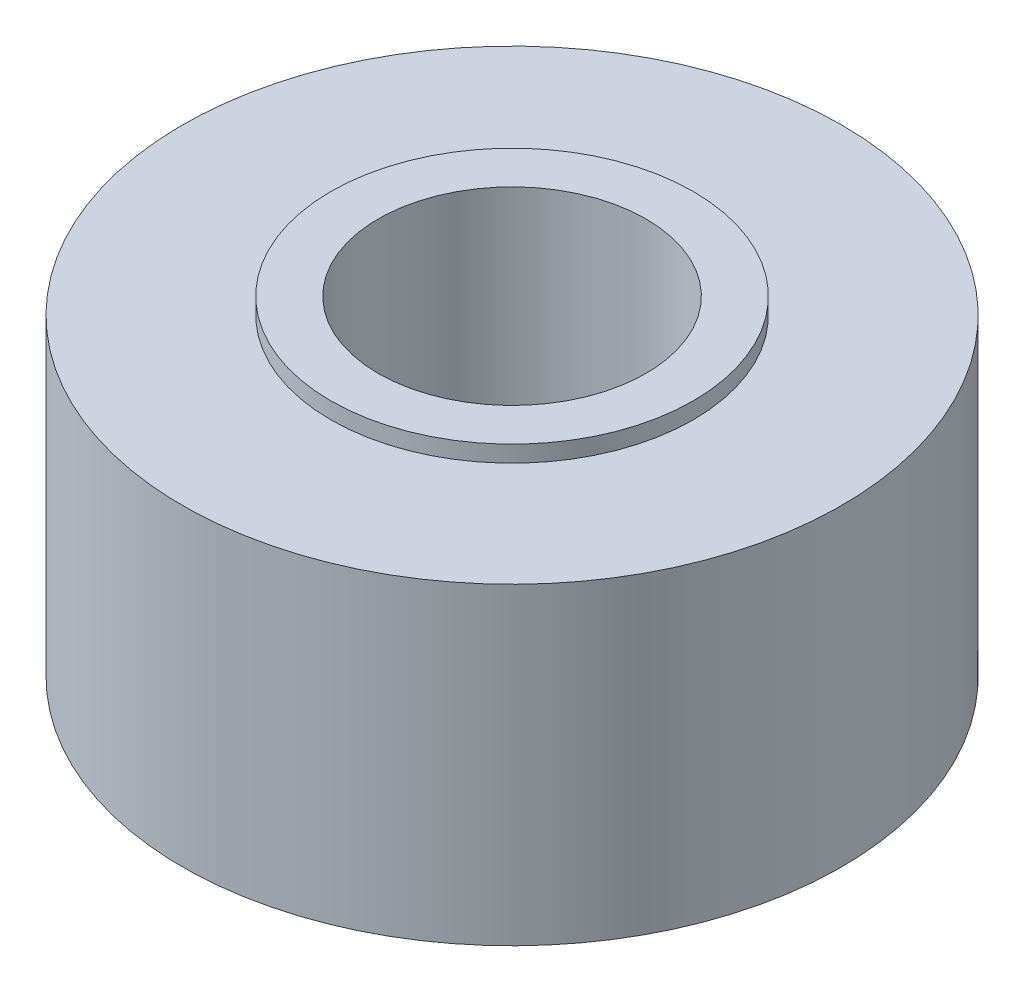
ISO-10303-21;
HEADER;
FILE_DESCRIPTION(('STEP AP214'),'2;1');
FILE_NAME('part.step','',(''),(''),'','','');
FILE_SCHEMA(('AUTOMOTIVE_DESIGN { 1 0 10303 214 1 1 1 1 }'));
ENDSEC;
DATA;
#1=APPLICATION_CONTEXT('core data for automotive mechanical design processes');
#2=APPLICATION_PROTOCOL_DEFINITION('international standard','automotive_design',2000,#1);
#3=PRODUCT_CONTEXT('',#1,'mechanical');
#4=PRODUCT('Part','Part','',(#3));
#5=PRODUCT_RELATED_PRODUCT_CATEGORY('part','',(#4));
#6=PRODUCT_DEFINITION_FORMATION('','',#4);
#7=PRODUCT_DEFINITION_CONTEXT('part definition',#1,'design');
#8=PRODUCT_DEFINITION('design','',#6,#7);
#9=PRODUCT_DEFINITION_SHAPE('','',#8);
#10=(LENGTH_UNIT() NAMED_UNIT(*) SI_UNIT(.MILLI.,.METRE.));
#11=(NAMED_UNIT(*) PLANE_ANGLE_UNIT() SI_UNIT($,.RADIAN.));
#12=(NAMED_UNIT(*) SI_UNIT($,.STERADIAN.) SOLID_ANGLE_UNIT());
#13=UNCERTAINTY_MEASURE_WITH_UNIT(LENGTH_MEASURE(1.E-05),#10,'distance_accuracy_value','');
#14=(GEOMETRIC_REPRESENTATION_CONTEXT(3) GLOBAL_UNCERTAINTY_ASSIGNED_CONTEXT((#13)) GLOBAL_UNIT_ASSIGNED_CONTEXT((#10,
#11,#12)) REPRESENTATION_CONTEXT('',''));
#15=CARTESIAN_POINT('',(0.,0.,0.));
#16=DIRECTION('',(0.,0.,1.));
#17=DIRECTION('',(1.,0.,0.));
#18=AXIS2_PLACEMENT_3D('',#15,#16,#17);
#19=CARTESIAN_POINT('',(0.,3.8,0.));
#20=DIRECTION('',(0.,1.,0.));
#21=DIRECTION('',(0.,0.,1.));
#22=AXIS2_PLACEMENT_3D('',#19,#20,#21);
#23=PLANE('',#22);
#24=CARTESIAN_POINT('',(0.,3.8,0.));
#25=DIRECTION('',(0.,1.,0.));
#26=DIRECTION('',(0.,0.,1.));
#27=AXIS2_PLACEMENT_3D('',#24,#25,#26);
#28=CIRCLE('',#27,4.);
#29=CARTESIAN_POINT('',(0.,3.8,-4.));
#30=VERTEX_POINT('',#29);
#31=EDGE_CURVE('E10',#30,#30,#28,.T.);
#32=ORIENTED_EDGE('',*,*,#31,.T.);
#33=EDGE_LOOP('',(#32));
#34=FACE_BOUND('',#33,.T.);
#35=CARTESIAN_POINT('',(0.,3.8,0.));
#36=DIRECTION('',(0.,1.,0.));
#37=DIRECTION('',(0.,0.,1.));
#38=AXIS2_PLACEMENT_3D('',#35,#36,#37);
#39=CIRCLE('',#38,2.2);
#40=CARTESIAN_POINT('',(0.,3.8,2.2));
#41=VERTEX_POINT('',#40);
#42=EDGE_CURVE('E49',#41,#41,#39,.T.);
#43=ORIENTED_EDGE('',*,*,#42,.F.);
#44=EDGE_LOOP('',(#43));
#45=FACE_BOUND('',#44,.T.);
#46=ADVANCED_FACE('F33',(#34,#45),#23,.T.);
#47=CARTESIAN_POINT('',(0.,0.,0.));
#48=DIRECTION('',(0.,1.,0.));
#49=DIRECTION('',(0.,0.,1.));
#50=AXIS2_PLACEMENT_3D('',#47,#48,#49);
#51=PLANE('',#50);
#52=CARTESIAN_POINT('',(0.,0.,0.));
#53=DIRECTION('',(0.,1.,0.));
#54=DIRECTION('',(0.,0.,1.));
#55=AXIS2_PLACEMENT_3D('',#52,#53,#54);
#56=CIRCLE('',#55,4.);
#57=CARTESIAN_POINT('',(0.,0.,-4.));
#58=VERTEX_POINT('',#57);
#59=EDGE_CURVE('E37',#58,#58,#56,.T.);
#60=ORIENTED_EDGE('',*,*,#59,.F.);
#61=EDGE_LOOP('',(#60));
#62=FACE_BOUND('',#61,.T.);
#63=CARTESIAN_POINT('',(0.,0.,0.));
#64=DIRECTION('',(0.,1.,0.));
#65=DIRECTION('',(0.,0.,1.));
#66=AXIS2_PLACEMENT_3D('',#63,#64,#65);
#67=CIRCLE('',#66,1.625);
#68=CARTESIAN_POINT('',(0.,0.,-1.625));
#69=VERTEX_POINT('',#68);
#70=EDGE_CURVE('E44',#69,#69,#67,.T.);
#71=ORIENTED_EDGE('',*,*,#70,.T.);
#72=EDGE_LOOP('',(#71));
#73=FACE_BOUND('',#72,.T.);
#74=ADVANCED_FACE('F74',(#62,#73),#51,.F.);
#75=CARTESIAN_POINT('',(0.,3.8,0.));
#76=DIRECTION('',(0.,-1.,0.));
#77=DIRECTION('',(0.,0.,-1.));
#78=AXIS2_PLACEMENT_3D('',#75,#76,#77);
#79=CYLINDRICAL_SURFACE('',#78,4.);
#80=CARTESIAN_POINT('',(0.,3.8,-4.));
#81=CARTESIAN_POINT('',(0.,3.76041666666667,-4.));
#82=CARTESIAN_POINT('',(0.,3.72083333333333,-4.));
#83=CARTESIAN_POINT('',(0.,3.64166666666667,-4.));
#84=CARTESIAN_POINT('',(0.,3.60208333333333,-4.));
#85=CARTESIAN_POINT('',(0.,3.52291666666667,-4.));
#86=CARTESIAN_POINT('',(0.,3.48333333333333,-4.));
#87=CARTESIAN_POINT('',(0.,3.40416666666667,-4.));
#88=CARTESIAN_POINT('',(0.,3.36458333333333,-4.));
#89=CARTESIAN_POINT('',(0.,3.28541666666667,-4.));
#90=CARTESIAN_POINT('',(0.,3.24583333333333,-4.));
#91=CARTESIAN_POINT('',(0.,3.16666666666667,-4.));
#92=CARTESIAN_POINT('',(0.,3.12708333333333,-4.));
#93=CARTESIAN_POINT('',(0.,3.04791666666667,-4.));
#94=CARTESIAN_POINT('',(0.,3.00833333333333,-4.));
#95=CARTESIAN_POINT('',(0.,2.92916666666667,-4.));
#96=CARTESIAN_POINT('',(0.,2.88958333333333,-4.));
#97=CARTESIAN_POINT('',(0.,2.81041666666667,-4.));
#98=CARTESIAN_POINT('',(0.,2.77083333333333,-4.));
#99=CARTESIAN_POINT('',(0.,2.69166666666667,-4.));
#100=CARTESIAN_POINT('',(0.,2.65208333333333,-4.));
#101=CARTESIAN_POINT('',(0.,2.57291666666667,-4.));
#102=CARTESIAN_POINT('',(0.,2.53333333333333,-4.));
#103=CARTESIAN_POINT('',(0.,2.45416666666667,-4.));
#104=CARTESIAN_POINT('',(0.,2.41458333333333,-4.));
#105=CARTESIAN_POINT('',(0.,2.33541666666667,-4.));
#106=CARTESIAN_POINT('',(0.,2.29583333333333,-4.));
#107=CARTESIAN_POINT('',(0.,2.21666666666667,-4.));
#108=CARTESIAN_POINT('',(0.,2.17708333333333,-4.));
#109=CARTESIAN_POINT('',(0.,2.09791666666667,-4.));
#110=CARTESIAN_POINT('',(0.,2.05833333333333,-4.));
#111=CARTESIAN_POINT('',(0.,1.97916666666667,-4.));
#112=CARTESIAN_POINT('',(0.,1.93958333333333,-4.));
#113=CARTESIAN_POINT('',(0.,1.86041666666667,-4.));
#114=CARTESIAN_POINT('',(0.,1.82083333333333,-4.));
#115=CARTESIAN_POINT('',(0.,1.74166666666667,-4.));
#116=CARTESIAN_POINT('',(0.,1.70208333333333,-4.));
#117=CARTESIAN_POINT('',(0.,1.62291666666667,-4.));
#118=CARTESIAN_POINT('',(0.,1.58333333333333,-4.));
#119=CARTESIAN_POINT('',(0.,1.50416666666667,-4.));
#120=CARTESIAN_POINT('',(0.,1.46458333333333,-4.));
#121=CARTESIAN_POINT('',(0.,1.38541666666667,-4.));
#122=CARTESIAN_POINT('',(0.,1.34583333333333,-4.));
#123=CARTESIAN_POINT('',(0.,1.26666666666667,-4.));
#124=CARTESIAN_POINT('',(0.,1.22708333333333,-4.));
#125=CARTESIAN_POINT('',(0.,1.14791666666667,-4.));
#126=CARTESIAN_POINT('',(0.,1.10833333333333,-4.));
#127=CARTESIAN_POINT('',(0.,1.02916666666667,-4.));
#128=CARTESIAN_POINT('',(0.,0.989583333333334,-4.));
#129=CARTESIAN_POINT('',(0.,0.910416666666667,-4.));
#130=CARTESIAN_POINT('',(0.,0.870833333333333,-4.));
#131=CARTESIAN_POINT('',(0.,0.791666666666667,-4.));
#132=CARTESIAN_POINT('',(0.,0.752083333333333,-4.));
#133=CARTESIAN_POINT('',(0.,0.672916666666667,-4.));
#134=CARTESIAN_POINT('',(0.,0.633333333333333,-4.));
#135=CARTESIAN_POINT('',(0.,0.554166666666667,-4.));
#136=CARTESIAN_POINT('',(0.,0.514583333333334,-4.));
#137=CARTESIAN_POINT('',(0.,0.435416666666667,-4.));
#138=CARTESIAN_POINT('',(0.,0.395833333333334,-4.));
#139=CARTESIAN_POINT('',(0.,0.316666666666667,-4.));
#140=CARTESIAN_POINT('',(0.,0.277083333333333,-4.));
#141=CARTESIAN_POINT('',(0.,0.197916666666667,-4.));
#142=CARTESIAN_POINT('',(0.,0.158333333333333,-4.));
#143=CARTESIAN_POINT('',(0.,0.0791666666666666,-4.));
#144=CARTESIAN_POINT('',(0.,0.0395833333333333,-4.));
#145=CARTESIAN_POINT('',(0.,0.,-4.));
#146=B_SPLINE_CURVE_WITH_KNOTS('',3,(#80,#81,#82,#83,#84,#85,#86,#87,#88,#89,#90,#91,#92,#93,
#94,#95,#96,#97,#98,#99,#100,#101,#102,#103,#104,#105,#106,#107,#108,#109,#110,#111,#112,#113,
#114,#115,#116,#117,#118,#119,#120,#121,#122,#123,#124,#125,#126,#127,#128,#129,#130,#131,#132,
#133,#134,#135,#136,#137,#138,#139,#140,#141,#142,#143,#144,#145),.UNSPECIFIED.,.F.,.F.,(4,2,2,
2,2,2,2,2,2,2,2,2,2,2,2,2,2,2,2,2,2,2,2,2,2,2,2,2,2,2,2,2,4),(0.,0.11875,0.2375,0.35625,0.475,
0.59375,0.7125,0.83125,0.95,1.06875,1.1875,1.30625,1.425,1.54375,1.6625,1.78125,1.9,2.01875,
2.1375,2.25625,2.375,2.49375,2.6125,2.73125,2.85,2.96875,3.0875,3.20625,3.325,3.44375,3.5625,
3.68125,3.8),.UNSPECIFIED.);
#147=EDGE_CURVE('BSEAM35',#30,#58,#146,.T.);
#148=ORIENTED_EDGE('',*,*,#31,.F.);
#149=ORIENTED_EDGE('',*,*,#59,.T.);
#150=ORIENTED_EDGE('',*,*,#147,.T.);
#151=ORIENTED_EDGE('',*,*,#147,.F.);
#152=EDGE_LOOP('',(#148,#150,#149,#151));
#153=FACE_BOUND('',#152,.T.);
#154=ADVANCED_FACE('F35',(#153),#79,.T.);
#155=CARTESIAN_POINT('',(0.,3.8,0.));
#156=DIRECTION('',(0.,-1.,0.));
#157=DIRECTION('',(0.,0.,-1.));
#158=AXIS2_PLACEMENT_3D('',#155,#156,#157);
#159=CYLINDRICAL_SURFACE('',#158,1.625);
#160=CARTESIAN_POINT('',(0.,4.,0.));
#161=DIRECTION('',(0.,1.,0.));
#162=DIRECTION('',(0.,0.,1.));
#163=AXIS2_PLACEMENT_3D('',#160,#161,#162);
#164=CIRCLE('',#163,1.625);
#165=CARTESIAN_POINT('',(0.,4.,-1.625));
#166=VERTEX_POINT('',#165);
#167=EDGE_CURVE('E52',#166,#166,#164,.T.);
#168=CARTESIAN_POINT('',(0.,0.,-1.625));
#169=CARTESIAN_POINT('',(0.,0.0416666666666667,-1.625));
#170=CARTESIAN_POINT('',(0.,0.0833333333333334,-1.625));
#171=CARTESIAN_POINT('',(0.,0.166666666666667,-1.625));
#172=CARTESIAN_POINT('',(0.,0.208333333333334,-1.625));
#173=CARTESIAN_POINT('',(0.,0.291666666666667,-1.625));
#174=CARTESIAN_POINT('',(0.,0.333333333333333,-1.625));
#175=CARTESIAN_POINT('',(0.,0.416666666666667,-1.625));
#176=CARTESIAN_POINT('',(0.,0.458333333333333,-1.625));
#177=CARTESIAN_POINT('',(0.,0.541666666666667,-1.625));
#178=CARTESIAN_POINT('',(0.,0.583333333333333,-1.625));
#179=CARTESIAN_POINT('',(0.,0.666666666666667,-1.625));
#180=CARTESIAN_POINT('',(0.,0.708333333333333,-1.625));
#181=CARTESIAN_POINT('',(0.,0.791666666666667,-1.625));
#182=CARTESIAN_POINT('',(0.,0.833333333333333,-1.625));
#183=CARTESIAN_POINT('',(0.,0.916666666666667,-1.625));
#184=CARTESIAN_POINT('',(0.,0.958333333333333,-1.625));
#185=CARTESIAN_POINT('',(0.,1.04166666666667,-1.625));
#186=CARTESIAN_POINT('',(0.,1.08333333333333,-1.625));
#187=CARTESIAN_POINT('',(0.,1.16666666666667,-1.625));
#188=CARTESIAN_POINT('',(0.,1.20833333333333,-1.625));
#189=CARTESIAN_POINT('',(0.,1.29166666666667,-1.625));
#190=CARTESIAN_POINT('',(0.,1.33333333333333,-1.625));
#191=CARTESIAN_POINT('',(0.,1.41666666666667,-1.625));
#192=CARTESIAN_POINT('',(0.,1.45833333333333,-1.625));
#193=CARTESIAN_POINT('',(0.,1.54166666666667,-1.625));
#194=CARTESIAN_POINT('',(0.,1.58333333333333,-1.625));
#195=CARTESIAN_POINT('',(0.,1.66666666666667,-1.625));
#196=CARTESIAN_POINT('',(0.,1.70833333333333,-1.625));
#197=CARTESIAN_POINT('',(0.,1.79166666666667,-1.625));
#198=CARTESIAN_POINT('',(0.,1.83333333333333,-1.625));
#199=CARTESIAN_POINT('',(0.,1.91666666666667,-1.625));
#200=CARTESIAN_POINT('',(0.,1.95833333333333,-1.625));
#201=CARTESIAN_POINT('',(0.,2.04166666666667,-1.625));
#202=CARTESIAN_POINT('',(0.,2.08333333333333,-1.625));
#203=CARTESIAN_POINT('',(0.,2.16666666666667,-1.625));
#204=CARTESIAN_POINT('',(0.,2.20833333333333,-1.625));
#205=CARTESIAN_POINT('',(0.,2.29166666666667,-1.625));
#206=CARTESIAN_POINT('',(0.,2.33333333333333,-1.625));
#207=CARTESIAN_POINT('',(0.,2.41666666666667,-1.625));
#208=CARTESIAN_POINT('',(0.,2.45833333333333,-1.625));
#209=CARTESIAN_POINT('',(0.,2.54166666666667,-1.625));
#210=CARTESIAN_POINT('',(0.,2.58333333333333,-1.625));
#211=CARTESIAN_POINT('',(0.,2.66666666666667,-1.625));
#212=CARTESIAN_POINT('',(0.,2.70833333333333,-1.625));
#213=CARTESIAN_POINT('',(0.,2.79166666666667,-1.625));
#214=CARTESIAN_POINT('',(0.,2.83333333333333,-1.625));
#215=CARTESIAN_POINT('',(0.,2.91666666666667,-1.625));
#216=CARTESIAN_POINT('',(0.,2.95833333333333,-1.625));
#217=CARTESIAN_POINT('',(0.,3.04166666666667,-1.625));
#218=CARTESIAN_POINT('',(0.,3.08333333333333,-1.625));
#219=CARTESIAN_POINT('',(0.,3.16666666666667,-1.625));
#220=CARTESIAN_POINT('',(0.,3.20833333333333,-1.625));
#221=CARTESIAN_POINT('',(0.,3.29166666666667,-1.625));
#222=CARTESIAN_POINT('',(0.,3.33333333333333,-1.625));
#223=CARTESIAN_POINT('',(0.,3.41666666666667,-1.625));
#224=CARTESIAN_POINT('',(0.,3.45833333333333,-1.625));
#225=CARTESIAN_POINT('',(0.,3.54166666666667,-1.625));
#226=CARTESIAN_POINT('',(0.,3.58333333333333,-1.625));
#227=CARTESIAN_POINT('',(0.,3.66666666666667,-1.625));
#228=CARTESIAN_POINT('',(0.,3.70833333333333,-1.625));
#229=CARTESIAN_POINT('',(0.,3.79166666666667,-1.625));
#230=CARTESIAN_POINT('',(0.,3.83333333333333,-1.625));
#231=CARTESIAN_POINT('',(0.,3.91666666666667,-1.625));
#232=CARTESIAN_POINT('',(0.,3.95833333333333,-1.625));
#233=CARTESIAN_POINT('',(0.,4.,-1.625));
#234=B_SPLINE_CURVE_WITH_KNOTS('',3,(#168,#169,#170,#171,#172,#173,#174,#175,#176,#177,#178,
#179,#180,#181,#182,#183,#184,#185,#186,#187,#188,#189,#190,#191,#192,#193,#194,#195,#196,#197,
#198,#199,#200,#201,#202,#203,#204,#205,#206,#207,#208,#209,#210,#211,#212,#213,#214,#215,#216,
#217,#218,#219,#220,#221,#222,#223,#224,#225,#226,#227,#228,#229,#230,#231,#232,#233),
.UNSPECIFIED.,.F.,.F.,(4,2,2,2,2,2,2,2,2,2,2,2,2,2,2,2,2,2,2,2,2,2,2,2,2,2,2,2,2,2,2,2,4),(0.,
0.125,0.25,0.375,0.5,0.625,0.75,0.875,1.,1.125,1.25,1.375,1.5,1.625,1.75,1.875,2.,2.125,2.25,
2.375,2.5,2.625,2.75,2.875,3.,3.125,3.25,3.375,3.5,3.625,3.75,3.875,4.),.UNSPECIFIED.);
#235=EDGE_CURVE('BSEAM58',#69,#166,#234,.T.);
#236=ORIENTED_EDGE('',*,*,#70,.F.);
#237=ORIENTED_EDGE('',*,*,#167,.T.);
#238=ORIENTED_EDGE('',*,*,#235,.T.);
#239=ORIENTED_EDGE('',*,*,#235,.F.);
#240=EDGE_LOOP('',(#236,#238,#237,#239));
#241=FACE_BOUND('',#240,.T.);
#242=ADVANCED_FACE('F58',(#241),#159,.F.);
#243=CARTESIAN_POINT('',(0.,4.,0.));
#244=DIRECTION('',(0.,1.,0.));
#245=DIRECTION('',(0.,0.,1.));
#246=AXIS2_PLACEMENT_3D('',#243,#244,#245);
#247=PLANE('',#246);
#248=CARTESIAN_POINT('',(0.,4.,0.));
#249=DIRECTION('',(0.,1.,0.));
#250=DIRECTION('',(0.,0.,1.));
#251=AXIS2_PLACEMENT_3D('',#248,#249,#250);
#252=CIRCLE('',#251,2.2);
#253=CARTESIAN_POINT('',(0.,4.,2.2));
#254=VERTEX_POINT('',#253);
#255=EDGE_CURVE('E48',#254,#254,#252,.T.);
#256=ORIENTED_EDGE('',*,*,#255,.T.);
#257=EDGE_LOOP('',(#256));
#258=FACE_BOUND('',#257,.T.);
#259=ORIENTED_EDGE('',*,*,#167,.F.);
#260=EDGE_LOOP('',(#259));
#261=FACE_BOUND('',#260,.T.);
#262=ADVANCED_FACE('F60',(#258,#261),#247,.T.);
#263=CARTESIAN_POINT('',(0.,4.,0.));
#264=DIRECTION('',(0.,-1.,0.));
#265=DIRECTION('',(0.,0.,-1.));
#266=AXIS2_PLACEMENT_3D('',#263,#264,#265);
#267=CYLINDRICAL_SURFACE('',#266,2.2);
#268=ORIENTED_EDGE('',*,*,#255,.F.);
#269=EDGE_LOOP('',(#268));
#270=FACE_BOUND('',#269,.T.);
#271=ORIENTED_EDGE('',*,*,#42,.T.);
#272=EDGE_LOOP('',(#271));
#273=FACE_BOUND('',#272,.T.);
#274=ADVANCED_FACE('F62',(#270,#273),#267,.T.);
#275=CLOSED_SHELL('',(#46,#74,#154,#242,#262,#274));
#276=MANIFOLD_SOLID_BREP('B2',#275);
#277=ADVANCED_BREP_SHAPE_REPRESENTATION('',(#18,#276),#14);
#278=SHAPE_DEFINITION_REPRESENTATION(#9,#277);
ENDSEC;
END-ISO-10303-21;
